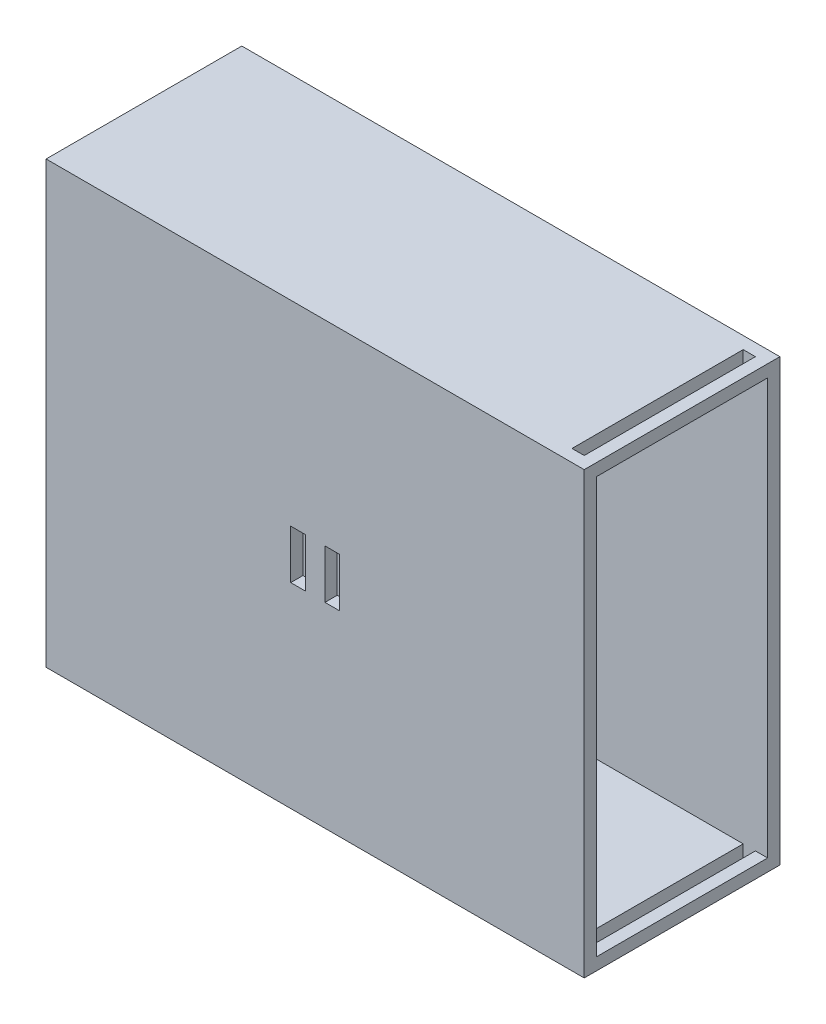
ISO-10303-21;
HEADER;
FILE_DESCRIPTION(('STEP AP214'),'2;1');
FILE_NAME('part.step','',(''),(''),'','','');
FILE_SCHEMA(('AUTOMOTIVE_DESIGN { 1 0 10303 214 1 1 1 1 }'));
ENDSEC;
DATA;
#1=APPLICATION_CONTEXT('core data for automotive mechanical design processes');
#2=APPLICATION_PROTOCOL_DEFINITION('international standard','automotive_design',2000,#1);
#3=PRODUCT_CONTEXT('',#1,'mechanical');
#4=PRODUCT('Part','Part','',(#3));
#5=PRODUCT_RELATED_PRODUCT_CATEGORY('part','',(#4));
#6=PRODUCT_DEFINITION_FORMATION('','',#4);
#7=PRODUCT_DEFINITION_CONTEXT('part definition',#1,'design');
#8=PRODUCT_DEFINITION('design','',#6,#7);
#9=PRODUCT_DEFINITION_SHAPE('','',#8);
#10=(LENGTH_UNIT() NAMED_UNIT(*) SI_UNIT(.MILLI.,.METRE.));
#11=(NAMED_UNIT(*) PLANE_ANGLE_UNIT() SI_UNIT($,.RADIAN.));
#12=(NAMED_UNIT(*) SI_UNIT($,.STERADIAN.) SOLID_ANGLE_UNIT());
#13=UNCERTAINTY_MEASURE_WITH_UNIT(LENGTH_MEASURE(1.E-05),#10,'distance_accuracy_value','');
#14=(GEOMETRIC_REPRESENTATION_CONTEXT(3) GLOBAL_UNCERTAINTY_ASSIGNED_CONTEXT((#13)) GLOBAL_UNIT_ASSIGNED_CONTEXT((#10,
#11,#12)) REPRESENTATION_CONTEXT('',''));
#15=CARTESIAN_POINT('',(0.,0.,0.));
#16=DIRECTION('',(0.,0.,1.));
#17=DIRECTION('',(1.,0.,0.));
#18=AXIS2_PLACEMENT_3D('',#15,#16,#17);
#19=CARTESIAN_POINT('',(-73.3283851904956,-6.35000000000002,0.));
#20=DIRECTION('',(0.,-1.,0.));
#21=DIRECTION('',(0.,0.,-1.));
#22=AXIS2_PLACEMENT_3D('',#19,#20,#21);
#23=PLANE('',#22);
#24=DIRECTION('',(0.,0.,1.));
#25=VECTOR('',#24,1.);
#26=CARTESIAN_POINT('',(193.371614809504,-6.35000000000002,0.));
#27=LINE('',#26,#25);
#28=CARTESIAN_POINT('',(193.371614809504,-6.35000000000002,6.35));
#29=VERTEX_POINT('',#28);
#30=CARTESIAN_POINT('',(193.371614809504,-6.35000000000002,95.25));
#31=VERTEX_POINT('',#30);
#32=EDGE_CURVE('E315',#29,#31,#27,.T.);
#33=ORIENTED_EDGE('',*,*,#32,.F.);
#34=DIRECTION('',(1.,0.,0.));
#35=VECTOR('',#34,1.);
#36=CARTESIAN_POINT('',(-73.3283851904956,-6.35000000000002,6.35));
#37=LINE('',#36,#35);
#38=CARTESIAN_POINT('',(199.721614809504,-6.35000000000002,6.35));
#39=VERTEX_POINT('',#38);
#40=EDGE_CURVE('E364',#29,#39,#37,.T.);
#41=ORIENTED_EDGE('',*,*,#40,.T.);
#42=DIRECTION('',(0.,0.,-1.));
#43=VECTOR('',#42,1.);
#44=CARTESIAN_POINT('',(199.721614809504,-6.35000000000002,0.));
#45=LINE('',#44,#43);
#46=CARTESIAN_POINT('',(199.721614809504,-6.35000000000002,95.25));
#47=VERTEX_POINT('',#46);
#48=EDGE_CURVE('E332',#47,#39,#45,.T.);
#49=ORIENTED_EDGE('',*,*,#48,.F.);
#50=DIRECTION('',(1.,0.,0.));
#51=VECTOR('',#50,1.);
#52=CARTESIAN_POINT('',(-73.3283851904956,-6.35000000000002,95.25));
#53=LINE('',#52,#51);
#54=EDGE_CURVE('E356',#31,#47,#53,.T.);
#55=ORIENTED_EDGE('',*,*,#54,.F.);
#56=EDGE_LOOP('',(#33,#41,#49,#55));
#57=FACE_BOUND('',#56,.T.);
#58=ADVANCED_FACE('F50',(#57),#23,.T.);
#59=CARTESIAN_POINT('',(-73.3283851904956,-222.25,0.));
#60=DIRECTION('',(0.,1.,0.));
#61=DIRECTION('',(0.,0.,1.));
#62=AXIS2_PLACEMENT_3D('',#59,#60,#61);
#63=PLANE('',#62);
#64=DIRECTION('',(0.,0.,-1.));
#65=VECTOR('',#64,1.);
#66=CARTESIAN_POINT('',(193.371614809504,-222.25,0.));
#67=LINE('',#66,#65);
#68=CARTESIAN_POINT('',(193.371614809504,-222.25,95.25));
#69=VERTEX_POINT('',#68);
#70=CARTESIAN_POINT('',(193.371614809504,-222.25,6.35));
#71=VERTEX_POINT('',#70);
#72=EDGE_CURVE('E423',#69,#71,#67,.T.);
#73=ORIENTED_EDGE('',*,*,#72,.F.);
#74=DIRECTION('',(1.,0.,0.));
#75=VECTOR('',#74,1.);
#76=CARTESIAN_POINT('',(-73.3283851904956,-222.25,95.25));
#77=LINE('',#76,#75);
#78=CARTESIAN_POINT('',(199.721614809504,-222.25,95.25));
#79=VERTEX_POINT('',#78);
#80=EDGE_CURVE('E337',#69,#79,#77,.T.);
#81=ORIENTED_EDGE('',*,*,#80,.T.);
#82=DIRECTION('',(0.,0.,1.));
#83=VECTOR('',#82,1.);
#84=CARTESIAN_POINT('',(199.721614809504,-222.25,0.));
#85=LINE('',#84,#83);
#86=CARTESIAN_POINT('',(199.721614809504,-222.25,6.35000000000005));
#87=VERTEX_POINT('',#86);
#88=EDGE_CURVE('E344',#87,#79,#85,.T.);
#89=ORIENTED_EDGE('',*,*,#88,.F.);
#90=DIRECTION('',(1.,0.,0.));
#91=VECTOR('',#90,1.);
#92=CARTESIAN_POINT('',(-73.3283851904956,-222.25,6.35000000000005));
#93=LINE('',#92,#91);
#94=EDGE_CURVE('E367',#71,#87,#93,.T.);
#95=ORIENTED_EDGE('',*,*,#94,.F.);
#96=EDGE_LOOP('',(#73,#81,#89,#95));
#97=FACE_BOUND('',#96,.T.);
#98=ADVANCED_FACE('F467',(#97),#63,.T.);
#99=CARTESIAN_POINT('',(199.721614809504,0.,101.6));
#100=DIRECTION('',(1.,0.,0.));
#101=DIRECTION('',(0.,0.,-1.));
#102=AXIS2_PLACEMENT_3D('',#99,#100,#101);
#103=PLANE('',#102);
#104=DIRECTION('',(0.,-1.,0.));
#105=VECTOR('',#104,1.);
#106=CARTESIAN_POINT('',(199.721614809504,0.,0.));
#107=LINE('',#106,#105);
#108=CARTESIAN_POINT('',(199.721614809504,0.,0.));
#109=VERTEX_POINT('',#108);
#110=CARTESIAN_POINT('',(199.721614809504,-228.6,0.));
#111=VERTEX_POINT('',#110);
#112=EDGE_CURVE('E396',#109,#111,#107,.T.);
#113=ORIENTED_EDGE('',*,*,#112,.F.);
#114=DIRECTION('',(0.,0.,-1.));
#115=VECTOR('',#114,1.);
#116=CARTESIAN_POINT('',(199.721614809504,0.,101.6));
#117=LINE('',#116,#115);
#118=CARTESIAN_POINT('',(199.721614809504,0.,101.6));
#119=VERTEX_POINT('',#118);
#120=EDGE_CURVE('E408',#119,#109,#117,.T.);
#121=ORIENTED_EDGE('',*,*,#120,.F.);
#122=DIRECTION('',(0.,-1.,0.));
#123=VECTOR('',#122,1.);
#124=CARTESIAN_POINT('',(199.721614809504,0.,101.6));
#125=LINE('',#124,#123);
#126=CARTESIAN_POINT('',(199.721614809504,-228.6,101.6));
#127=VERTEX_POINT('',#126);
#128=EDGE_CURVE('E383',#119,#127,#125,.T.);
#129=ORIENTED_EDGE('',*,*,#128,.T.);
#130=DIRECTION('',(0.,0.,-1.));
#131=VECTOR('',#130,1.);
#132=CARTESIAN_POINT('',(199.721614809504,-228.6,101.6));
#133=LINE('',#132,#131);
#134=EDGE_CURVE('E415',#127,#111,#133,.T.);
#135=ORIENTED_EDGE('',*,*,#134,.T.);
#136=EDGE_LOOP('',(#113,#121,#129,#135));
#137=FACE_BOUND('',#136,.T.);
#138=ORIENTED_EDGE('',*,*,#88,.T.);
#139=DIRECTION('',(0.,1.,0.));
#140=VECTOR('',#139,1.);
#141=CARTESIAN_POINT('',(199.721614809504,0.,95.25));
#142=LINE('',#141,#140);
#143=EDGE_CURVE('E324',#79,#47,#142,.T.);
#144=ORIENTED_EDGE('',*,*,#143,.T.);
#145=ORIENTED_EDGE('',*,*,#48,.T.);
#146=DIRECTION('',(0.,-1.,0.));
#147=VECTOR('',#146,1.);
#148=CARTESIAN_POINT('',(199.721614809504,0.,6.35));
#149=LINE('',#148,#147);
#150=EDGE_CURVE('E346',#39,#87,#149,.T.);
#151=ORIENTED_EDGE('',*,*,#150,.T.);
#152=EDGE_LOOP('',(#138,#144,#145,#151));
#153=FACE_BOUND('',#152,.T.);
#154=ADVANCED_FACE('F475',(#137,#153),#103,.T.);
#155=CARTESIAN_POINT('',(-79.6783851904956,0.,101.6));
#156=DIRECTION('',(-1.,0.,0.));
#157=DIRECTION('',(0.,0.,1.));
#158=AXIS2_PLACEMENT_3D('',#155,#156,#157);
#159=PLANE('',#158);
#160=DIRECTION('',(0.,1.,0.));
#161=VECTOR('',#160,1.);
#162=CARTESIAN_POINT('',(-79.6783851904956,0.,0.));
#163=LINE('',#162,#161);
#164=CARTESIAN_POINT('',(-79.6783851904956,-228.6,0.));
#165=VERTEX_POINT('',#164);
#166=CARTESIAN_POINT('',(-79.6783851904956,0.,0.));
#167=VERTEX_POINT('',#166);
#168=EDGE_CURVE('E359',#165,#167,#163,.T.);
#169=ORIENTED_EDGE('',*,*,#168,.F.);
#170=DIRECTION('',(0.,0.,-1.));
#171=VECTOR('',#170,1.);
#172=CARTESIAN_POINT('',(-79.6783851904956,-228.6,101.6));
#173=LINE('',#172,#171);
#174=CARTESIAN_POINT('',(-79.6783851904956,-228.6,101.6));
#175=VERTEX_POINT('',#174);
#176=EDGE_CURVE('E411',#175,#165,#173,.T.);
#177=ORIENTED_EDGE('',*,*,#176,.F.);
#178=DIRECTION('',(0.,1.,0.));
#179=VECTOR('',#178,1.);
#180=CARTESIAN_POINT('',(-79.6783851904956,0.,101.6));
#181=LINE('',#180,#179);
#182=CARTESIAN_POINT('',(-79.6783851904956,0.,101.6));
#183=VERTEX_POINT('',#182);
#184=EDGE_CURVE('E374',#175,#183,#181,.T.);
#185=ORIENTED_EDGE('',*,*,#184,.T.);
#186=DIRECTION('',(0.,0.,-1.));
#187=VECTOR('',#186,1.);
#188=CARTESIAN_POINT('',(-79.6783851904956,0.,101.6));
#189=LINE('',#188,#187);
#190=EDGE_CURVE('E391',#183,#167,#189,.T.);
#191=ORIENTED_EDGE('',*,*,#190,.T.);
#192=EDGE_LOOP('',(#169,#177,#185,#191));
#193=FACE_BOUND('',#192,.T.);
#194=ADVANCED_FACE('F47',(#193),#159,.T.);
#195=CARTESIAN_POINT('',(0.,-228.6,101.6));
#196=DIRECTION('',(0.,-1.,0.));
#197=DIRECTION('',(0.,0.,-1.));
#198=AXIS2_PLACEMENT_3D('',#195,#196,#197);
#199=PLANE('',#198);
#200=DIRECTION('',(1.,0.,0.));
#201=VECTOR('',#200,1.);
#202=CARTESIAN_POINT('',(0.,-228.6,6.35000000000002));
#203=LINE('',#202,#201);
#204=CARTESIAN_POINT('',(187.021614809504,-228.6,6.35));
#205=VERTEX_POINT('',#204);
#206=CARTESIAN_POINT('',(193.371614809504,-228.6,6.35));
#207=VERTEX_POINT('',#206);
#208=EDGE_CURVE('E325',#205,#207,#203,.T.);
#209=ORIENTED_EDGE('',*,*,#208,.F.);
#210=DIRECTION('',(0.,0.,-1.));
#211=VECTOR('',#210,1.);
#212=CARTESIAN_POINT('',(187.021614809504,-228.6,101.6));
#213=LINE('',#212,#211);
#214=CARTESIAN_POINT('',(187.021614809504,-228.6,95.25));
#215=VERTEX_POINT('',#214);
#216=EDGE_CURVE('E310',#215,#205,#213,.T.);
#217=ORIENTED_EDGE('',*,*,#216,.F.);
#218=DIRECTION('',(-1.,0.,0.));
#219=VECTOR('',#218,1.);
#220=CARTESIAN_POINT('',(0.,-228.6,95.25));
#221=LINE('',#220,#219);
#222=CARTESIAN_POINT('',(193.371614809504,-228.6,95.25));
#223=VERTEX_POINT('',#222);
#224=EDGE_CURVE('E318',#223,#215,#221,.T.);
#225=ORIENTED_EDGE('',*,*,#224,.F.);
#226=DIRECTION('',(0.,0.,1.));
#227=VECTOR('',#226,1.);
#228=CARTESIAN_POINT('',(193.371614809504,-228.6,101.6));
#229=LINE('',#228,#227);
#230=EDGE_CURVE('E312',#207,#223,#229,.T.);
#231=ORIENTED_EDGE('',*,*,#230,.F.);
#232=EDGE_LOOP('',(#209,#217,#225,#231));
#233=FACE_BOUND('',#232,.T.);
#234=DIRECTION('',(-1.,0.,0.));
#235=VECTOR('',#234,1.);
#236=CARTESIAN_POINT('',(0.,-228.6,0.));
#237=LINE('',#236,#235);
#238=EDGE_CURVE('E397',#111,#165,#237,.T.);
#239=ORIENTED_EDGE('',*,*,#238,.F.);
#240=ORIENTED_EDGE('',*,*,#134,.F.);
#241=DIRECTION('',(-1.,0.,0.));
#242=VECTOR('',#241,1.);
#243=CARTESIAN_POINT('',(0.,-228.6,101.6));
#244=LINE('',#243,#242);
#245=EDGE_CURVE('E377',#127,#175,#244,.T.);
#246=ORIENTED_EDGE('',*,*,#245,.T.);
#247=ORIENTED_EDGE('',*,*,#176,.T.);
#248=EDGE_LOOP('',(#239,#240,#246,#247));
#249=FACE_BOUND('',#248,.T.);
#250=ADVANCED_FACE('F547',(#233,#249),#199,.T.);
#251=CARTESIAN_POINT('',(0.,0.,101.6));
#252=DIRECTION('',(0.,1.,0.));
#253=DIRECTION('',(0.,0.,1.));
#254=AXIS2_PLACEMENT_3D('',#251,#252,#253);
#255=PLANE('',#254);
#256=DIRECTION('',(-1.,0.,0.));
#257=VECTOR('',#256,1.);
#258=CARTESIAN_POINT('',(193.371614809504,0.,6.35));
#259=LINE('',#258,#257);
#260=CARTESIAN_POINT('',(193.371614809504,0.,6.35));
#261=VERTEX_POINT('',#260);
#262=CARTESIAN_POINT('',(187.021614809504,0.,6.35000000000001));
#263=VERTEX_POINT('',#262);
#264=EDGE_CURVE('E243',#261,#263,#259,.T.);
#265=ORIENTED_EDGE('',*,*,#264,.F.);
#266=DIRECTION('',(0.,0.,-1.));
#267=VECTOR('',#266,1.);
#268=CARTESIAN_POINT('',(193.371614809504,0.,95.25));
#269=LINE('',#268,#267);
#270=CARTESIAN_POINT('',(193.371614809504,0.,95.25));
#271=VERTEX_POINT('',#270);
#272=EDGE_CURVE('E282',#271,#261,#269,.T.);
#273=ORIENTED_EDGE('',*,*,#272,.F.);
#274=DIRECTION('',(1.,0.,0.));
#275=VECTOR('',#274,1.);
#276=CARTESIAN_POINT('',(187.021614809504,0.,95.25));
#277=LINE('',#276,#275);
#278=CARTESIAN_POINT('',(187.021614809504,0.,95.25));
#279=VERTEX_POINT('',#278);
#280=EDGE_CURVE('E284',#279,#271,#277,.T.);
#281=ORIENTED_EDGE('',*,*,#280,.F.);
#282=DIRECTION('',(0.,0.,1.));
#283=VECTOR('',#282,1.);
#284=CARTESIAN_POINT('',(187.021614809504,0.,6.35));
#285=LINE('',#284,#283);
#286=EDGE_CURVE('E280',#263,#279,#285,.T.);
#287=ORIENTED_EDGE('',*,*,#286,.F.);
#288=EDGE_LOOP('',(#265,#273,#281,#287));
#289=FACE_BOUND('',#288,.T.);
#290=DIRECTION('',(1.,0.,0.));
#291=VECTOR('',#290,1.);
#292=CARTESIAN_POINT('',(0.,0.,0.));
#293=LINE('',#292,#291);
#294=EDGE_CURVE('E379',#167,#109,#293,.T.);
#295=ORIENTED_EDGE('',*,*,#294,.F.);
#296=ORIENTED_EDGE('',*,*,#190,.F.);
#297=DIRECTION('',(1.,0.,0.));
#298=VECTOR('',#297,1.);
#299=CARTESIAN_POINT('',(0.,0.,101.6));
#300=LINE('',#299,#298);
#301=EDGE_CURVE('E389',#183,#119,#300,.T.);
#302=ORIENTED_EDGE('',*,*,#301,.T.);
#303=ORIENTED_EDGE('',*,*,#120,.T.);
#304=EDGE_LOOP('',(#295,#296,#302,#303));
#305=FACE_BOUND('',#304,.T.);
#306=ADVANCED_FACE('F515',(#289,#305),#255,.T.);
#307=CARTESIAN_POINT('',(0.,0.,101.6));
#308=DIRECTION('',(0.,0.,1.));
#309=DIRECTION('',(1.,0.,0.));
#310=AXIS2_PLACEMENT_3D('',#307,#308,#309);
#311=PLANE('',#310);
#312=DIRECTION('',(-1.,0.,0.));
#313=VECTOR('',#312,1.);
#314=CARTESIAN_POINT('',(54.9416148095044,-101.6,101.6));
#315=LINE('',#314,#313);
#316=CARTESIAN_POINT('',(54.9416148095044,-101.6,101.6));
#317=VERTEX_POINT('',#316);
#318=CARTESIAN_POINT('',(47.3216148095044,-101.6,101.6));
#319=VERTEX_POINT('',#318);
#320=EDGE_CURVE('E65',#317,#319,#315,.T.);
#321=ORIENTED_EDGE('',*,*,#320,.F.);
#322=DIRECTION('',(0.,1.,0.));
#323=VECTOR('',#322,1.);
#324=CARTESIAN_POINT('',(54.9416148095044,-127.,101.6));
#325=LINE('',#324,#323);
#326=CARTESIAN_POINT('',(54.9416148095044,-127.,101.6));
#327=VERTEX_POINT('',#326);
#328=EDGE_CURVE('E234',#327,#317,#325,.T.);
#329=ORIENTED_EDGE('',*,*,#328,.F.);
#330=DIRECTION('',(1.,0.,0.));
#331=VECTOR('',#330,1.);
#332=CARTESIAN_POINT('',(47.3216148095044,-127.,101.6));
#333=LINE('',#332,#331);
#334=CARTESIAN_POINT('',(47.3216148095044,-127.,101.6));
#335=VERTEX_POINT('',#334);
#336=EDGE_CURVE('E214',#335,#327,#333,.T.);
#337=ORIENTED_EDGE('',*,*,#336,.F.);
#338=DIRECTION('',(0.,-1.,0.));
#339=VECTOR('',#338,1.);
#340=CARTESIAN_POINT('',(47.3216148095044,-101.6,101.6));
#341=LINE('',#340,#339);
#342=EDGE_CURVE('E229',#319,#335,#341,.T.);
#343=ORIENTED_EDGE('',*,*,#342,.F.);
#344=EDGE_LOOP('',(#321,#329,#337,#343));
#345=FACE_BOUND('',#344,.T.);
#346=DIRECTION('',(0.,-1.,0.));
#347=VECTOR('',#346,1.);
#348=CARTESIAN_POINT('',(65.1016148095044,-127.,101.6));
#349=LINE('',#348,#347);
#350=CARTESIAN_POINT('',(65.1016148095044,-101.6,101.6));
#351=VERTEX_POINT('',#350);
#352=CARTESIAN_POINT('',(65.1016148095044,-127.,101.6));
#353=VERTEX_POINT('',#352);
#354=EDGE_CURVE('E72',#351,#353,#349,.T.);
#355=ORIENTED_EDGE('',*,*,#354,.F.);
#356=DIRECTION('',(-1.,0.,0.));
#357=VECTOR('',#356,1.);
#358=CARTESIAN_POINT('',(65.1016148095044,-101.6,101.6));
#359=LINE('',#358,#357);
#360=CARTESIAN_POINT('',(72.7216148095044,-101.6,101.6));
#361=VERTEX_POINT('',#360);
#362=EDGE_CURVE('E252',#361,#351,#359,.T.);
#363=ORIENTED_EDGE('',*,*,#362,.F.);
#364=DIRECTION('',(0.,1.,0.));
#365=VECTOR('',#364,1.);
#366=CARTESIAN_POINT('',(72.7216148095044,-101.6,101.6));
#367=LINE('',#366,#365);
#368=CARTESIAN_POINT('',(72.7216148095044,-127.,101.6));
#369=VERTEX_POINT('',#368);
#370=EDGE_CURVE('E264',#369,#361,#367,.T.);
#371=ORIENTED_EDGE('',*,*,#370,.F.);
#372=DIRECTION('',(1.,0.,0.));
#373=VECTOR('',#372,1.);
#374=CARTESIAN_POINT('',(72.7216148095044,-127.,101.6));
#375=LINE('',#374,#373);
#376=EDGE_CURVE('E267',#353,#369,#375,.T.);
#377=ORIENTED_EDGE('',*,*,#376,.F.);
#378=EDGE_LOOP('',(#355,#363,#371,#377));
#379=FACE_BOUND('',#378,.T.);
#380=ORIENTED_EDGE('',*,*,#184,.F.);
#381=ORIENTED_EDGE('',*,*,#245,.F.);
#382=ORIENTED_EDGE('',*,*,#128,.F.);
#383=ORIENTED_EDGE('',*,*,#301,.F.);
#384=EDGE_LOOP('',(#380,#381,#382,#383));
#385=FACE_BOUND('',#384,.T.);
#386=ADVANCED_FACE('F232',(#345,#379,#385),#311,.T.);
#387=CARTESIAN_POINT('',(0.,0.,0.));
#388=DIRECTION('',(0.,0.,1.));
#389=DIRECTION('',(1.,0.,0.));
#390=AXIS2_PLACEMENT_3D('',#387,#388,#389);
#391=PLANE('',#390);
#392=ORIENTED_EDGE('',*,*,#168,.T.);
#393=ORIENTED_EDGE('',*,*,#294,.T.);
#394=ORIENTED_EDGE('',*,*,#112,.T.);
#395=ORIENTED_EDGE('',*,*,#238,.T.);
#396=EDGE_LOOP('',(#392,#393,#394,#395));
#397=FACE_BOUND('',#396,.T.);
#398=ADVANCED_FACE('F489',(#397),#391,.F.);
#399=CARTESIAN_POINT('',(-73.3283851904956,0.,95.25));
#400=DIRECTION('',(0.,0.,-1.));
#401=DIRECTION('',(-1.,0.,0.));
#402=AXIS2_PLACEMENT_3D('',#399,#400,#401);
#403=PLANE('',#402);
#404=DIRECTION('',(1.,0.,0.));
#405=VECTOR('',#404,1.);
#406=CARTESIAN_POINT('',(-73.3283851904956,-101.6,95.25));
#407=LINE('',#406,#405);
#408=CARTESIAN_POINT('',(47.3216148095044,-101.6,95.25));
#409=VERTEX_POINT('',#408);
#410=CARTESIAN_POINT('',(54.9416148095044,-101.6,95.25));
#411=VERTEX_POINT('',#410);
#412=EDGE_CURVE('E11',#409,#411,#407,.T.);
#413=ORIENTED_EDGE('',*,*,#412,.F.);
#414=DIRECTION('',(0.,1.,0.));
#415=VECTOR('',#414,1.);
#416=CARTESIAN_POINT('',(47.3216148095044,0.,95.25));
#417=LINE('',#416,#415);
#418=CARTESIAN_POINT('',(47.3216148095044,-127.,95.25));
#419=VERTEX_POINT('',#418);
#420=EDGE_CURVE('E440',#419,#409,#417,.T.);
#421=ORIENTED_EDGE('',*,*,#420,.F.);
#422=DIRECTION('',(-1.,0.,0.));
#423=VECTOR('',#422,1.);
#424=CARTESIAN_POINT('',(-73.3283851904956,-127.,95.25));
#425=LINE('',#424,#423);
#426=CARTESIAN_POINT('',(54.9416148095044,-127.,95.25));
#427=VERTEX_POINT('',#426);
#428=EDGE_CURVE('E217',#427,#419,#425,.T.);
#429=ORIENTED_EDGE('',*,*,#428,.F.);
#430=DIRECTION('',(0.,-1.,0.));
#431=VECTOR('',#430,1.);
#432=CARTESIAN_POINT('',(54.9416148095044,0.,95.25));
#433=LINE('',#432,#431);
#434=EDGE_CURVE('E57',#411,#427,#433,.T.);
#435=ORIENTED_EDGE('',*,*,#434,.F.);
#436=EDGE_LOOP('',(#413,#421,#429,#435));
#437=FACE_BOUND('',#436,.T.);
#438=DIRECTION('',(0.,1.,0.));
#439=VECTOR('',#438,1.);
#440=CARTESIAN_POINT('',(65.1016148095044,0.,95.25));
#441=LINE('',#440,#439);
#442=CARTESIAN_POINT('',(65.1016148095044,-127.,95.25));
#443=VERTEX_POINT('',#442);
#444=CARTESIAN_POINT('',(65.1016148095044,-101.6,95.25));
#445=VERTEX_POINT('',#444);
#446=EDGE_CURVE('E432',#443,#445,#441,.T.);
#447=ORIENTED_EDGE('',*,*,#446,.F.);
#448=DIRECTION('',(-1.,0.,0.));
#449=VECTOR('',#448,1.);
#450=CARTESIAN_POINT('',(-73.3283851904956,-127.,95.25));
#451=LINE('',#450,#449);
#452=CARTESIAN_POINT('',(72.7216148095044,-127.,95.25));
#453=VERTEX_POINT('',#452);
#454=EDGE_CURVE('E424',#453,#443,#451,.T.);
#455=ORIENTED_EDGE('',*,*,#454,.F.);
#456=DIRECTION('',(0.,-1.,0.));
#457=VECTOR('',#456,1.);
#458=CARTESIAN_POINT('',(72.7216148095044,0.,95.25));
#459=LINE('',#458,#457);
#460=CARTESIAN_POINT('',(72.7216148095044,-101.6,95.25));
#461=VERTEX_POINT('',#460);
#462=EDGE_CURVE('E430',#461,#453,#459,.T.);
#463=ORIENTED_EDGE('',*,*,#462,.F.);
#464=DIRECTION('',(1.,0.,0.));
#465=VECTOR('',#464,1.);
#466=CARTESIAN_POINT('',(-73.3283851904956,-101.6,95.25));
#467=LINE('',#466,#465);
#468=EDGE_CURVE('E431',#445,#461,#467,.T.);
#469=ORIENTED_EDGE('',*,*,#468,.F.);
#470=EDGE_LOOP('',(#447,#455,#463,#469));
#471=FACE_BOUND('',#470,.T.);
#472=CARTESIAN_POINT('',(-73.3283851904956,-6.35000000000002,95.25));
#473=VERTEX_POINT('',#472);
#474=CARTESIAN_POINT('',(187.021614809504,-6.35000000000002,95.25));
#475=VERTEX_POINT('',#474);
#476=EDGE_CURVE('E352',#473,#475,#53,.T.);
#477=ORIENTED_EDGE('',*,*,#476,.T.);
#478=DIRECTION('',(0.,1.,0.));
#479=VECTOR('',#478,1.);
#480=CARTESIAN_POINT('',(187.021614809504,-273.05,95.25));
#481=LINE('',#480,#479);
#482=EDGE_CURVE('E298',#475,#279,#481,.T.);
#483=ORIENTED_EDGE('',*,*,#482,.T.);
#484=ORIENTED_EDGE('',*,*,#280,.T.);
#485=DIRECTION('',(0.,1.,0.));
#486=VECTOR('',#485,1.);
#487=CARTESIAN_POINT('',(193.371614809504,-273.05,95.25));
#488=LINE('',#487,#486);
#489=EDGE_CURVE('E293',#31,#271,#488,.T.);
#490=ORIENTED_EDGE('',*,*,#489,.F.);
#491=ORIENTED_EDGE('',*,*,#54,.T.);
#492=ORIENTED_EDGE('',*,*,#143,.F.);
#493=ORIENTED_EDGE('',*,*,#80,.F.);
#494=EDGE_CURVE('E294',#223,#69,#488,.T.);
#495=ORIENTED_EDGE('',*,*,#494,.F.);
#496=ORIENTED_EDGE('',*,*,#224,.T.);
#497=CARTESIAN_POINT('',(187.021614809504,-222.25,95.25));
#498=VERTEX_POINT('',#497);
#499=EDGE_CURVE('E300',#215,#498,#481,.T.);
#500=ORIENTED_EDGE('',*,*,#499,.T.);
#501=CARTESIAN_POINT('',(-73.3283851904956,-222.25,95.25));
#502=VERTEX_POINT('',#501);
#503=EDGE_CURVE('E371',#502,#498,#77,.T.);
#504=ORIENTED_EDGE('',*,*,#503,.F.);
#505=DIRECTION('',(0.,1.,0.));
#506=VECTOR('',#505,1.);
#507=CARTESIAN_POINT('',(-73.3283851904956,0.,95.25));
#508=LINE('',#507,#506);
#509=EDGE_CURVE('E326',#502,#473,#508,.T.);
#510=ORIENTED_EDGE('',*,*,#509,.T.);
#511=EDGE_LOOP('',(#477,#483,#484,#490,#491,#492,#493,#495,#496,#500,#504,#510));
#512=FACE_BOUND('',#511,.T.);
#513=ADVANCED_FACE('F450',(#437,#471,#512),#403,.T.);
#514=DIRECTION('',(0.,0.,-1.));
#515=VECTOR('',#514,1.);
#516=CARTESIAN_POINT('',(187.021614809504,-6.35000000000002,0.));
#517=LINE('',#516,#515);
#518=CARTESIAN_POINT('',(187.021614809504,-6.35000000000002,6.35));
#519=VERTEX_POINT('',#518);
#520=EDGE_CURVE('E308',#475,#519,#517,.T.);
#521=ORIENTED_EDGE('',*,*,#520,.F.);
#522=ORIENTED_EDGE('',*,*,#476,.F.);
#523=DIRECTION('',(0.,0.,-1.));
#524=VECTOR('',#523,1.);
#525=CARTESIAN_POINT('',(-73.3283851904956,-6.35000000000002,0.));
#526=LINE('',#525,#524);
#527=CARTESIAN_POINT('',(-73.3283851904956,-6.35000000000002,6.35));
#528=VERTEX_POINT('',#527);
#529=EDGE_CURVE('E336',#473,#528,#526,.T.);
#530=ORIENTED_EDGE('',*,*,#529,.T.);
#531=EDGE_CURVE('E363',#528,#519,#37,.T.);
#532=ORIENTED_EDGE('',*,*,#531,.T.);
#533=EDGE_LOOP('',(#521,#522,#530,#532));
#534=FACE_BOUND('',#533,.T.);
#535=ADVANCED_FACE('F469',(#534),#23,.T.);
#536=CARTESIAN_POINT('',(-73.3283851904956,0.,6.35));
#537=DIRECTION('',(0.,0.,1.));
#538=DIRECTION('',(0.,-1.,0.));
#539=AXIS2_PLACEMENT_3D('',#536,#537,#538);
#540=PLANE('',#539);
#541=ORIENTED_EDGE('',*,*,#40,.F.);
#542=DIRECTION('',(0.,1.,0.));
#543=VECTOR('',#542,1.);
#544=CARTESIAN_POINT('',(193.371614809504,-273.05,6.35));
#545=LINE('',#544,#543);
#546=EDGE_CURVE('E286',#29,#261,#545,.T.);
#547=ORIENTED_EDGE('',*,*,#546,.T.);
#548=ORIENTED_EDGE('',*,*,#264,.T.);
#549=DIRECTION('',(0.,1.,0.));
#550=VECTOR('',#549,1.);
#551=CARTESIAN_POINT('',(187.021614809504,-273.05,6.35));
#552=LINE('',#551,#550);
#553=EDGE_CURVE('E289',#519,#263,#552,.T.);
#554=ORIENTED_EDGE('',*,*,#553,.F.);
#555=ORIENTED_EDGE('',*,*,#531,.F.);
#556=DIRECTION('',(0.,-1.,0.));
#557=VECTOR('',#556,1.);
#558=CARTESIAN_POINT('',(-73.3283851904956,0.,6.35));
#559=LINE('',#558,#557);
#560=CARTESIAN_POINT('',(-73.3283851904956,-222.25,6.35000000000005));
#561=VERTEX_POINT('',#560);
#562=EDGE_CURVE('E331',#528,#561,#559,.T.);
#563=ORIENTED_EDGE('',*,*,#562,.T.);
#564=CARTESIAN_POINT('',(187.021614809504,-222.25,6.35000000000005));
#565=VERTEX_POINT('',#564);
#566=EDGE_CURVE('E368',#561,#565,#93,.T.);
#567=ORIENTED_EDGE('',*,*,#566,.T.);
#568=EDGE_CURVE('E305',#205,#565,#552,.T.);
#569=ORIENTED_EDGE('',*,*,#568,.F.);
#570=ORIENTED_EDGE('',*,*,#208,.T.);
#571=EDGE_CURVE('E291',#207,#71,#545,.T.);
#572=ORIENTED_EDGE('',*,*,#571,.T.);
#573=ORIENTED_EDGE('',*,*,#94,.T.);
#574=ORIENTED_EDGE('',*,*,#150,.F.);
#575=EDGE_LOOP('',(#541,#547,#548,#554,#555,#563,#567,#569,#570,#572,#573,#574));
#576=FACE_BOUND('',#575,.T.);
#577=ADVANCED_FACE('F485',(#576),#540,.T.);
#578=DIRECTION('',(0.,0.,1.));
#579=VECTOR('',#578,1.);
#580=CARTESIAN_POINT('',(187.021614809504,-222.25,0.));
#581=LINE('',#580,#579);
#582=EDGE_CURVE('E416',#565,#498,#581,.T.);
#583=ORIENTED_EDGE('',*,*,#582,.F.);
#584=ORIENTED_EDGE('',*,*,#566,.F.);
#585=DIRECTION('',(0.,0.,1.));
#586=VECTOR('',#585,1.);
#587=CARTESIAN_POINT('',(-73.3283851904956,-222.25,0.));
#588=LINE('',#587,#586);
#589=EDGE_CURVE('E329',#561,#502,#588,.T.);
#590=ORIENTED_EDGE('',*,*,#589,.T.);
#591=ORIENTED_EDGE('',*,*,#503,.T.);
#592=EDGE_LOOP('',(#583,#584,#590,#591));
#593=FACE_BOUND('',#592,.T.);
#594=ADVANCED_FACE('F480',(#593),#63,.T.);
#595=CARTESIAN_POINT('',(-73.3283851904956,0.,0.));
#596=DIRECTION('',(1.,0.,0.));
#597=DIRECTION('',(0.,0.,-1.));
#598=AXIS2_PLACEMENT_3D('',#595,#596,#597);
#599=PLANE('',#598);
#600=ORIENTED_EDGE('',*,*,#509,.F.);
#601=ORIENTED_EDGE('',*,*,#589,.F.);
#602=ORIENTED_EDGE('',*,*,#562,.F.);
#603=ORIENTED_EDGE('',*,*,#529,.F.);
#604=EDGE_LOOP('',(#600,#601,#602,#603));
#605=FACE_BOUND('',#604,.T.);
#606=ADVANCED_FACE('F505',(#605),#599,.T.);
#607=CARTESIAN_POINT('',(193.371614809504,-273.05,95.25));
#608=DIRECTION('',(1.,0.,0.));
#609=DIRECTION('',(0.,0.,-1.));
#610=AXIS2_PLACEMENT_3D('',#607,#608,#609);
#611=PLANE('',#610);
#612=ORIENTED_EDGE('',*,*,#230,.T.);
#613=ORIENTED_EDGE('',*,*,#494,.T.);
#614=ORIENTED_EDGE('',*,*,#72,.T.);
#615=ORIENTED_EDGE('',*,*,#571,.F.);
#616=EDGE_LOOP('',(#612,#613,#614,#615));
#617=FACE_BOUND('',#616,.T.);
#618=ADVANCED_FACE('F539',(#617),#611,.F.);
#619=CARTESIAN_POINT('',(187.021614809504,-273.05,6.35));
#620=DIRECTION('',(-1.,0.,0.));
#621=DIRECTION('',(0.,0.,1.));
#622=AXIS2_PLACEMENT_3D('',#619,#620,#621);
#623=PLANE('',#622);
#624=ORIENTED_EDGE('',*,*,#216,.T.);
#625=ORIENTED_EDGE('',*,*,#568,.T.);
#626=ORIENTED_EDGE('',*,*,#582,.T.);
#627=ORIENTED_EDGE('',*,*,#499,.F.);
#628=EDGE_LOOP('',(#624,#625,#626,#627));
#629=FACE_BOUND('',#628,.T.);
#630=ADVANCED_FACE('F535',(#629),#623,.F.);
#631=ORIENTED_EDGE('',*,*,#32,.T.);
#632=ORIENTED_EDGE('',*,*,#489,.T.);
#633=ORIENTED_EDGE('',*,*,#272,.T.);
#634=ORIENTED_EDGE('',*,*,#546,.F.);
#635=EDGE_LOOP('',(#631,#632,#633,#634));
#636=FACE_BOUND('',#635,.T.);
#637=ADVANCED_FACE('F578',(#636),#611,.F.);
#638=ORIENTED_EDGE('',*,*,#520,.T.);
#639=ORIENTED_EDGE('',*,*,#553,.T.);
#640=ORIENTED_EDGE('',*,*,#286,.T.);
#641=ORIENTED_EDGE('',*,*,#482,.F.);
#642=EDGE_LOOP('',(#638,#639,#640,#641));
#643=FACE_BOUND('',#642,.T.);
#644=ADVANCED_FACE('F509',(#643),#623,.F.);
#645=CARTESIAN_POINT('',(65.1016148095044,-127.,76.2));
#646=DIRECTION('',(-1.,0.,0.));
#647=DIRECTION('',(0.,0.,1.));
#648=AXIS2_PLACEMENT_3D('',#645,#646,#647);
#649=PLANE('',#648);
#650=ORIENTED_EDGE('',*,*,#446,.T.);
#651=DIRECTION('',(0.,0.,1.));
#652=VECTOR('',#651,1.);
#653=CARTESIAN_POINT('',(65.1016148095044,-101.6,76.2));
#654=LINE('',#653,#652);
#655=EDGE_CURVE('E259',#445,#351,#654,.T.);
#656=ORIENTED_EDGE('',*,*,#655,.T.);
#657=ORIENTED_EDGE('',*,*,#354,.T.);
#658=DIRECTION('',(0.,0.,1.));
#659=VECTOR('',#658,1.);
#660=CARTESIAN_POINT('',(65.1016148095044,-127.,76.2));
#661=LINE('',#660,#659);
#662=EDGE_CURVE('E249',#443,#353,#661,.T.);
#663=ORIENTED_EDGE('',*,*,#662,.F.);
#664=EDGE_LOOP('',(#650,#656,#657,#663));
#665=FACE_BOUND('',#664,.T.);
#666=ADVANCED_FACE('F584',(#665),#649,.F.);
#667=CARTESIAN_POINT('',(65.1016148095044,-101.6,76.2));
#668=DIRECTION('',(0.,1.,0.));
#669=DIRECTION('',(0.,0.,1.));
#670=AXIS2_PLACEMENT_3D('',#667,#668,#669);
#671=PLANE('',#670);
#672=ORIENTED_EDGE('',*,*,#468,.T.);
#673=DIRECTION('',(0.,0.,1.));
#674=VECTOR('',#673,1.);
#675=CARTESIAN_POINT('',(72.7216148095044,-101.6,76.2));
#676=LINE('',#675,#674);
#677=EDGE_CURVE('E258',#461,#361,#676,.T.);
#678=ORIENTED_EDGE('',*,*,#677,.T.);
#679=ORIENTED_EDGE('',*,*,#362,.T.);
#680=ORIENTED_EDGE('',*,*,#655,.F.);
#681=EDGE_LOOP('',(#672,#678,#679,#680));
#682=FACE_BOUND('',#681,.T.);
#683=ADVANCED_FACE('F617',(#682),#671,.F.);
#684=CARTESIAN_POINT('',(72.7216148095044,-101.6,76.2));
#685=DIRECTION('',(1.,0.,0.));
#686=DIRECTION('',(0.,0.,-1.));
#687=AXIS2_PLACEMENT_3D('',#684,#685,#686);
#688=PLANE('',#687);
#689=ORIENTED_EDGE('',*,*,#462,.T.);
#690=DIRECTION('',(0.,0.,1.));
#691=VECTOR('',#690,1.);
#692=CARTESIAN_POINT('',(72.7216148095044,-127.,76.2));
#693=LINE('',#692,#691);
#694=EDGE_CURVE('E251',#453,#369,#693,.T.);
#695=ORIENTED_EDGE('',*,*,#694,.T.);
#696=ORIENTED_EDGE('',*,*,#370,.T.);
#697=ORIENTED_EDGE('',*,*,#677,.F.);
#698=EDGE_LOOP('',(#689,#695,#696,#697));
#699=FACE_BOUND('',#698,.T.);
#700=ADVANCED_FACE('F458',(#699),#688,.F.);
#701=CARTESIAN_POINT('',(72.7216148095044,-127.,76.2));
#702=DIRECTION('',(0.,-1.,0.));
#703=DIRECTION('',(0.,0.,-1.));
#704=AXIS2_PLACEMENT_3D('',#701,#702,#703);
#705=PLANE('',#704);
#706=ORIENTED_EDGE('',*,*,#454,.T.);
#707=ORIENTED_EDGE('',*,*,#662,.T.);
#708=ORIENTED_EDGE('',*,*,#376,.T.);
#709=ORIENTED_EDGE('',*,*,#694,.F.);
#710=EDGE_LOOP('',(#706,#707,#708,#709));
#711=FACE_BOUND('',#710,.T.);
#712=ADVANCED_FACE('F453',(#711),#705,.F.);
#713=CARTESIAN_POINT('',(54.9416148095044,-101.6,76.2));
#714=DIRECTION('',(0.,1.,0.));
#715=DIRECTION('',(0.,0.,1.));
#716=AXIS2_PLACEMENT_3D('',#713,#714,#715);
#717=PLANE('',#716);
#718=ORIENTED_EDGE('',*,*,#412,.T.);
#719=DIRECTION('',(0.,0.,1.));
#720=VECTOR('',#719,1.);
#721=CARTESIAN_POINT('',(54.9416148095044,-101.6,76.2));
#722=LINE('',#721,#720);
#723=EDGE_CURVE('E244',#411,#317,#722,.T.);
#724=ORIENTED_EDGE('',*,*,#723,.T.);
#725=ORIENTED_EDGE('',*,*,#320,.T.);
#726=DIRECTION('',(0.,0.,1.));
#727=VECTOR('',#726,1.);
#728=CARTESIAN_POINT('',(47.3216148095044,-101.6,76.2));
#729=LINE('',#728,#727);
#730=EDGE_CURVE('E224',#409,#319,#729,.T.);
#731=ORIENTED_EDGE('',*,*,#730,.F.);
#732=EDGE_LOOP('',(#718,#724,#725,#731));
#733=FACE_BOUND('',#732,.T.);
#734=ADVANCED_FACE('F447',(#733),#717,.F.);
#735=CARTESIAN_POINT('',(54.9416148095044,-127.,76.2));
#736=DIRECTION('',(1.,0.,0.));
#737=DIRECTION('',(0.,1.,0.));
#738=AXIS2_PLACEMENT_3D('',#735,#736,#737);
#739=PLANE('',#738);
#740=ORIENTED_EDGE('',*,*,#434,.T.);
#741=DIRECTION('',(0.,0.,1.));
#742=VECTOR('',#741,1.);
#743=CARTESIAN_POINT('',(54.9416148095044,-127.,76.2));
#744=LINE('',#743,#742);
#745=EDGE_CURVE('E225',#427,#327,#744,.T.);
#746=ORIENTED_EDGE('',*,*,#745,.T.);
#747=ORIENTED_EDGE('',*,*,#328,.T.);
#748=ORIENTED_EDGE('',*,*,#723,.F.);
#749=EDGE_LOOP('',(#740,#746,#747,#748));
#750=FACE_BOUND('',#749,.T.);
#751=ADVANCED_FACE('F443',(#750),#739,.F.);
#752=CARTESIAN_POINT('',(47.3216148095044,-127.,76.2));
#753=DIRECTION('',(0.,-1.,0.));
#754=DIRECTION('',(0.,0.,-1.));
#755=AXIS2_PLACEMENT_3D('',#752,#753,#754);
#756=PLANE('',#755);
#757=ORIENTED_EDGE('',*,*,#428,.T.);
#758=DIRECTION('',(0.,0.,1.));
#759=VECTOR('',#758,1.);
#760=CARTESIAN_POINT('',(47.3216148095044,-127.,76.2));
#761=LINE('',#760,#759);
#762=EDGE_CURVE('E209',#419,#335,#761,.T.);
#763=ORIENTED_EDGE('',*,*,#762,.T.);
#764=ORIENTED_EDGE('',*,*,#336,.T.);
#765=ORIENTED_EDGE('',*,*,#745,.F.);
#766=EDGE_LOOP('',(#757,#763,#764,#765));
#767=FACE_BOUND('',#766,.T.);
#768=ADVANCED_FACE('F215',(#767),#756,.F.);
#769=CARTESIAN_POINT('',(47.3216148095044,-101.6,76.2));
#770=DIRECTION('',(-1.,0.,0.));
#771=DIRECTION('',(0.,0.,1.));
#772=AXIS2_PLACEMENT_3D('',#769,#770,#771);
#773=PLANE('',#772);
#774=ORIENTED_EDGE('',*,*,#420,.T.);
#775=ORIENTED_EDGE('',*,*,#730,.T.);
#776=ORIENTED_EDGE('',*,*,#342,.T.);
#777=ORIENTED_EDGE('',*,*,#762,.F.);
#778=EDGE_LOOP('',(#774,#775,#776,#777));
#779=FACE_BOUND('',#778,.T.);
#780=ADVANCED_FACE('F226',(#779),#773,.F.);
#781=CLOSED_SHELL('',(#58,#98,#154,#194,#250,#306,#386,#398,#513,#535,#577,#594,#606,#618,#630,
#637,#644,#666,#683,#700,#712,#734,#751,#768,#780));
#782=MANIFOLD_SOLID_BREP('B2',#781);
#783=ADVANCED_BREP_SHAPE_REPRESENTATION('',(#18,#782),#14);
#784=SHAPE_DEFINITION_REPRESENTATION(#9,#783);
ENDSEC;
END-ISO-10303-21;
